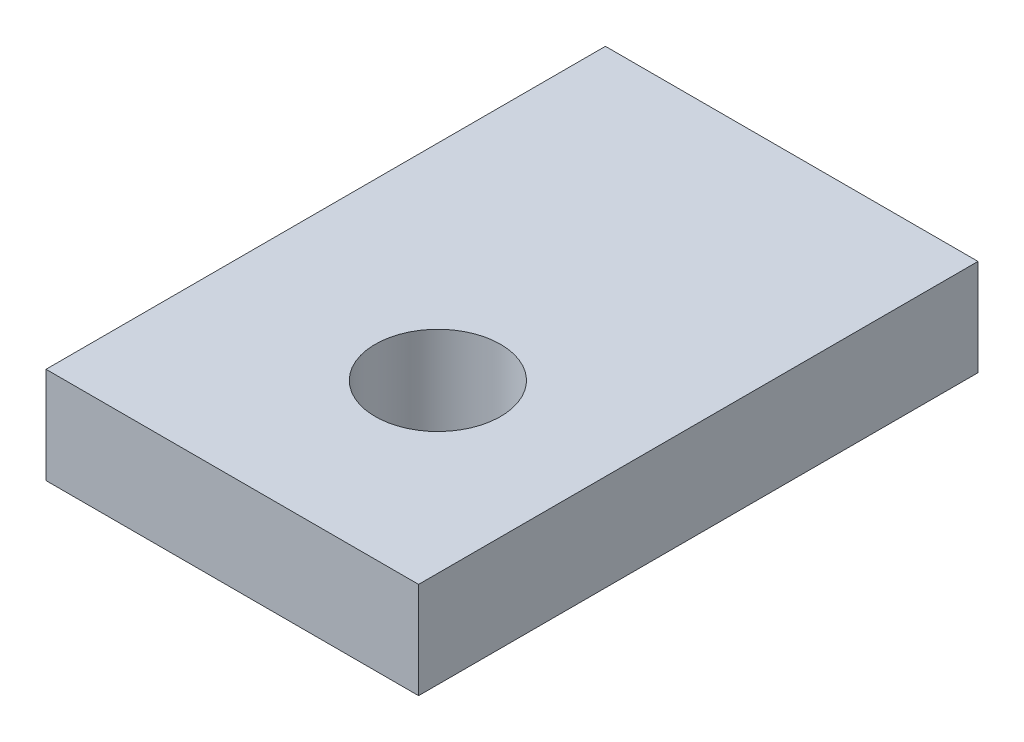
ISO-10303-21;
HEADER;
FILE_DESCRIPTION(('STEP AP214'),'2;1');
FILE_NAME('part.step','',(''),(''),'','','');
FILE_SCHEMA(('AUTOMOTIVE_DESIGN { 1 0 10303 214 1 1 1 1 }'));
ENDSEC;
DATA;
#1=APPLICATION_CONTEXT('core data for automotive mechanical design processes');
#2=APPLICATION_PROTOCOL_DEFINITION('international standard','automotive_design',2000,#1);
#3=PRODUCT_CONTEXT('',#1,'mechanical');
#4=PRODUCT('Part','Part','',(#3));
#5=PRODUCT_RELATED_PRODUCT_CATEGORY('part','',(#4));
#6=PRODUCT_DEFINITION_FORMATION('','',#4);
#7=PRODUCT_DEFINITION_CONTEXT('part definition',#1,'design');
#8=PRODUCT_DEFINITION('design','',#6,#7);
#9=PRODUCT_DEFINITION_SHAPE('','',#8);
#10=(LENGTH_UNIT() NAMED_UNIT(*) SI_UNIT(.MILLI.,.METRE.));
#11=(NAMED_UNIT(*) PLANE_ANGLE_UNIT() SI_UNIT($,.RADIAN.));
#12=(NAMED_UNIT(*) SI_UNIT($,.STERADIAN.) SOLID_ANGLE_UNIT());
#13=UNCERTAINTY_MEASURE_WITH_UNIT(LENGTH_MEASURE(1.E-05),#10,'distance_accuracy_value','');
#14=(GEOMETRIC_REPRESENTATION_CONTEXT(3) GLOBAL_UNCERTAINTY_ASSIGNED_CONTEXT((#13)) GLOBAL_UNIT_ASSIGNED_CONTEXT((#10,
#11,#12)) REPRESENTATION_CONTEXT('',''));
#15=CARTESIAN_POINT('',(0.,0.,0.));
#16=DIRECTION('',(0.,0.,1.));
#17=DIRECTION('',(1.,0.,0.));
#18=AXIS2_PLACEMENT_3D('',#15,#16,#17);
#19=CARTESIAN_POINT('',(0.,6.35,0.));
#20=DIRECTION('',(0.,1.,0.));
#21=DIRECTION('',(0.,0.,-1.));
#22=AXIS2_PLACEMENT_3D('',#19,#20,#21);
#23=PLANE('',#22);
#24=DIRECTION('',(-1.,0.,0.));
#25=VECTOR('',#24,1.);
#26=CARTESIAN_POINT('',(-1.22514845490862E-13,6.35,0.));
#27=LINE('',#26,#25);
#28=CARTESIAN_POINT('',(24.5399999419997,6.35,0.));
#29=VERTEX_POINT('',#28);
#30=CARTESIAN_POINT('',(-1.22514845490862E-13,6.35,0.));
#31=VERTEX_POINT('',#30);
#32=EDGE_CURVE('E97',#29,#31,#27,.T.);
#33=ORIENTED_EDGE('',*,*,#32,.F.);
#34=DIRECTION('',(0.,0.,1.));
#35=VECTOR('',#34,1.);
#36=CARTESIAN_POINT('',(24.5399999419997,6.35,-36.845));
#37=LINE('',#36,#35);
#38=CARTESIAN_POINT('',(24.5399999419997,6.35,-36.845));
#39=VERTEX_POINT('',#38);
#40=EDGE_CURVE('E100',#39,#29,#37,.T.);
#41=ORIENTED_EDGE('',*,*,#40,.F.);
#42=DIRECTION('',(1.,0.,0.));
#43=VECTOR('',#42,1.);
#44=CARTESIAN_POINT('',(0.,6.35,-36.845));
#45=LINE('',#44,#43);
#46=CARTESIAN_POINT('',(0.,6.35,-36.845));
#47=VERTEX_POINT('',#46);
#48=EDGE_CURVE('E88',#47,#39,#45,.T.);
#49=ORIENTED_EDGE('',*,*,#48,.F.);
#50=DIRECTION('',(0.,0.,-1.));
#51=VECTOR('',#50,1.);
#52=CARTESIAN_POINT('',(-1.22514845490862E-13,6.35,0.));
#53=LINE('',#52,#51);
#54=EDGE_CURVE('E93',#31,#47,#53,.T.);
#55=ORIENTED_EDGE('',*,*,#54,.F.);
#56=EDGE_LOOP('',(#33,#41,#49,#55));
#57=FACE_BOUND('',#56,.T.);
#58=CARTESIAN_POINT('',(13.54,6.35,-12.27));
#59=DIRECTION('',(0.,-1.,0.));
#60=DIRECTION('',(0.,0.,-1.));
#61=AXIS2_PLACEMENT_3D('',#58,#59,#60);
#62=CIRCLE('',#61,4.127);
#63=CARTESIAN_POINT('',(13.54,6.35,-16.397));
#64=VERTEX_POINT('',#63);
#65=EDGE_CURVE('E109',#64,#64,#62,.T.);
#66=ORIENTED_EDGE('',*,*,#65,.T.);
#67=EDGE_LOOP('',(#66));
#68=FACE_BOUND('',#67,.T.);
#69=ADVANCED_FACE('F41',(#57,#68),#23,.T.);
#70=CARTESIAN_POINT('',(0.,0.,0.));
#71=DIRECTION('',(0.,1.,0.));
#72=DIRECTION('',(0.,0.,-1.));
#73=AXIS2_PLACEMENT_3D('',#70,#71,#72);
#74=PLANE('',#73);
#75=DIRECTION('',(-1.,0.,0.));
#76=VECTOR('',#75,1.);
#77=CARTESIAN_POINT('',(-1.22514845490862E-13,0.,0.));
#78=LINE('',#77,#76);
#79=CARTESIAN_POINT('',(24.5399999419997,0.,0.));
#80=VERTEX_POINT('',#79);
#81=CARTESIAN_POINT('',(-1.22514845490862E-13,0.,0.));
#82=VERTEX_POINT('',#81);
#83=EDGE_CURVE('E105',#80,#82,#78,.T.);
#84=ORIENTED_EDGE('',*,*,#83,.T.);
#85=DIRECTION('',(0.,0.,-1.));
#86=VECTOR('',#85,1.);
#87=CARTESIAN_POINT('',(-1.22514845490862E-13,0.,0.));
#88=LINE('',#87,#86);
#89=CARTESIAN_POINT('',(0.,0.,-36.845));
#90=VERTEX_POINT('',#89);
#91=EDGE_CURVE('E108',#82,#90,#88,.T.);
#92=ORIENTED_EDGE('',*,*,#91,.T.);
#93=DIRECTION('',(1.,0.,0.));
#94=VECTOR('',#93,1.);
#95=CARTESIAN_POINT('',(0.,0.,-36.845));
#96=LINE('',#95,#94);
#97=CARTESIAN_POINT('',(24.5399999419997,0.,-36.845));
#98=VERTEX_POINT('',#97);
#99=EDGE_CURVE('E91',#90,#98,#96,.T.);
#100=ORIENTED_EDGE('',*,*,#99,.T.);
#101=DIRECTION('',(0.,0.,1.));
#102=VECTOR('',#101,1.);
#103=CARTESIAN_POINT('',(24.5399999419997,0.,-36.845));
#104=LINE('',#103,#102);
#105=EDGE_CURVE('E112',#98,#80,#104,.T.);
#106=ORIENTED_EDGE('',*,*,#105,.T.);
#107=EDGE_LOOP('',(#84,#92,#100,#106));
#108=FACE_BOUND('',#107,.T.);
#109=CARTESIAN_POINT('',(13.54,0.,-12.27));
#110=DIRECTION('',(0.,-1.,0.));
#111=DIRECTION('',(0.,0.,-1.));
#112=AXIS2_PLACEMENT_3D('',#109,#110,#111);
#113=CIRCLE('',#112,4.127);
#114=CARTESIAN_POINT('',(13.54,0.,-16.397));
#115=VERTEX_POINT('',#114);
#116=EDGE_CURVE('E117',#115,#115,#113,.T.);
#117=ORIENTED_EDGE('',*,*,#116,.F.);
#118=EDGE_LOOP('',(#117));
#119=FACE_BOUND('',#118,.T.);
#120=ADVANCED_FACE('F130',(#108,#119),#74,.F.);
#121=CARTESIAN_POINT('',(-1.22514845490862E-13,6.35,0.));
#122=DIRECTION('',(0.,0.,-1.));
#123=DIRECTION('',(1.,0.,0.));
#124=AXIS2_PLACEMENT_3D('',#121,#122,#123);
#125=PLANE('',#124);
#126=ORIENTED_EDGE('',*,*,#83,.F.);
#127=DIRECTION('',(0.,-1.,0.));
#128=VECTOR('',#127,1.);
#129=CARTESIAN_POINT('',(24.5399999419997,6.35,0.));
#130=LINE('',#129,#128);
#131=EDGE_CURVE('E58',#29,#80,#130,.T.);
#132=ORIENTED_EDGE('',*,*,#131,.F.);
#133=ORIENTED_EDGE('',*,*,#32,.T.);
#134=DIRECTION('',(0.,-1.,0.));
#135=VECTOR('',#134,1.);
#136=CARTESIAN_POINT('',(-1.22514845490862E-13,6.35,0.));
#137=LINE('',#136,#135);
#138=EDGE_CURVE('E11',#31,#82,#137,.T.);
#139=ORIENTED_EDGE('',*,*,#138,.T.);
#140=EDGE_LOOP('',(#126,#132,#133,#139));
#141=FACE_BOUND('',#140,.T.);
#142=ADVANCED_FACE('F43',(#141),#125,.F.);
#143=CARTESIAN_POINT('',(-1.22514845490862E-13,6.35,0.));
#144=DIRECTION('',(1.,0.,0.));
#145=DIRECTION('',(0.,0.,1.));
#146=AXIS2_PLACEMENT_3D('',#143,#144,#145);
#147=PLANE('',#146);
#148=ORIENTED_EDGE('',*,*,#91,.F.);
#149=ORIENTED_EDGE('',*,*,#138,.F.);
#150=ORIENTED_EDGE('',*,*,#54,.T.);
#151=DIRECTION('',(0.,-1.,0.));
#152=VECTOR('',#151,1.);
#153=CARTESIAN_POINT('',(0.,6.35,-36.845));
#154=LINE('',#153,#152);
#155=EDGE_CURVE('E50',#47,#90,#154,.T.);
#156=ORIENTED_EDGE('',*,*,#155,.T.);
#157=EDGE_LOOP('',(#148,#149,#150,#156));
#158=FACE_BOUND('',#157,.T.);
#159=ADVANCED_FACE('F94',(#158),#147,.F.);
#160=CARTESIAN_POINT('',(0.,6.35,-36.845));
#161=DIRECTION('',(0.,0.,1.));
#162=DIRECTION('',(-1.,0.,0.));
#163=AXIS2_PLACEMENT_3D('',#160,#161,#162);
#164=PLANE('',#163);
#165=ORIENTED_EDGE('',*,*,#99,.F.);
#166=ORIENTED_EDGE('',*,*,#155,.F.);
#167=ORIENTED_EDGE('',*,*,#48,.T.);
#168=DIRECTION('',(0.,-1.,0.));
#169=VECTOR('',#168,1.);
#170=CARTESIAN_POINT('',(24.5399999419997,6.35,-36.845));
#171=LINE('',#170,#169);
#172=EDGE_CURVE('E74',#39,#98,#171,.T.);
#173=ORIENTED_EDGE('',*,*,#172,.T.);
#174=EDGE_LOOP('',(#165,#166,#167,#173));
#175=FACE_BOUND('',#174,.T.);
#176=ADVANCED_FACE('F86',(#175),#164,.F.);
#177=CARTESIAN_POINT('',(24.5399999419997,6.35,-36.845));
#178=DIRECTION('',(-1.,0.,0.));
#179=DIRECTION('',(0.,0.,-1.));
#180=AXIS2_PLACEMENT_3D('',#177,#178,#179);
#181=PLANE('',#180);
#182=ORIENTED_EDGE('',*,*,#105,.F.);
#183=ORIENTED_EDGE('',*,*,#172,.F.);
#184=ORIENTED_EDGE('',*,*,#40,.T.);
#185=ORIENTED_EDGE('',*,*,#131,.T.);
#186=EDGE_LOOP('',(#182,#183,#184,#185));
#187=FACE_BOUND('',#186,.T.);
#188=ADVANCED_FACE('F126',(#187),#181,.F.);
#189=CARTESIAN_POINT('',(13.54,6.35,-12.27));
#190=DIRECTION('',(0.,-1.,0.));
#191=DIRECTION('',(0.,0.,1.));
#192=AXIS2_PLACEMENT_3D('',#189,#190,#191);
#193=CYLINDRICAL_SURFACE('',#192,4.127);
#194=ORIENTED_EDGE('',*,*,#65,.F.);
#195=EDGE_LOOP('',(#194));
#196=FACE_BOUND('',#195,.T.);
#197=ORIENTED_EDGE('',*,*,#116,.T.);
#198=EDGE_LOOP('',(#197));
#199=FACE_BOUND('',#198,.T.);
#200=ADVANCED_FACE('F123',(#196,#199),#193,.F.);
#201=CLOSED_SHELL('',(#69,#120,#142,#159,#176,#188,#200));
#202=MANIFOLD_SOLID_BREP('B2',#201);
#203=ADVANCED_BREP_SHAPE_REPRESENTATION('',(#18,#202),#14);
#204=SHAPE_DEFINITION_REPRESENTATION(#9,#203);
ENDSEC;
END-ISO-10303-21;
